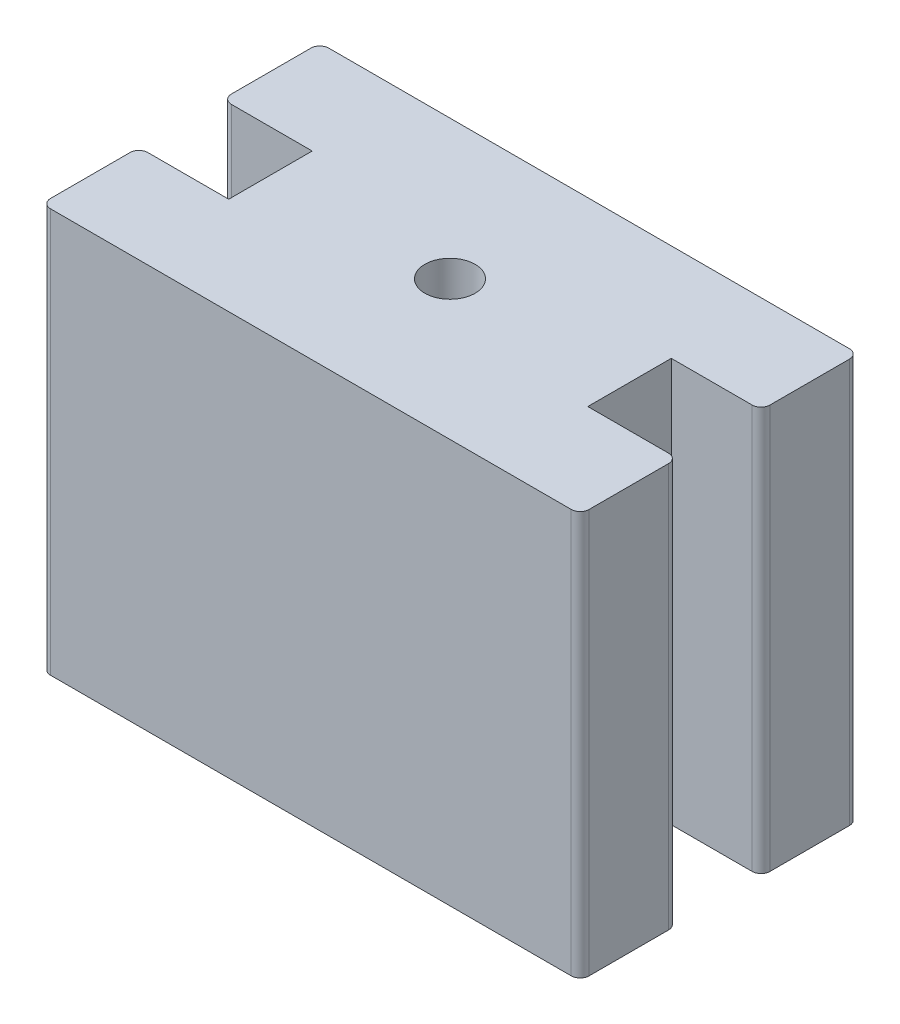
ISO-10303-21;
HEADER;
FILE_DESCRIPTION(('STEP AP214'),'2;1');
FILE_NAME('part.step','',(''),(''),'','','');
FILE_SCHEMA(('AUTOMOTIVE_DESIGN { 1 0 10303 214 1 1 1 1 }'));
ENDSEC;
DATA;
#1=APPLICATION_CONTEXT('core data for automotive mechanical design processes');
#2=APPLICATION_PROTOCOL_DEFINITION('international standard','automotive_design',2000,#1);
#3=PRODUCT_CONTEXT('',#1,'mechanical');
#4=PRODUCT('Part','Part','',(#3));
#5=PRODUCT_RELATED_PRODUCT_CATEGORY('part','',(#4));
#6=PRODUCT_DEFINITION_FORMATION('','',#4);
#7=PRODUCT_DEFINITION_CONTEXT('part definition',#1,'design');
#8=PRODUCT_DEFINITION('design','',#6,#7);
#9=PRODUCT_DEFINITION_SHAPE('','',#8);
#10=(LENGTH_UNIT() NAMED_UNIT(*) SI_UNIT(.MILLI.,.METRE.));
#11=(NAMED_UNIT(*) PLANE_ANGLE_UNIT() SI_UNIT($,.RADIAN.));
#12=(NAMED_UNIT(*) SI_UNIT($,.STERADIAN.) SOLID_ANGLE_UNIT());
#13=UNCERTAINTY_MEASURE_WITH_UNIT(LENGTH_MEASURE(1.E-05),#10,'distance_accuracy_value','');
#14=(GEOMETRIC_REPRESENTATION_CONTEXT(3) GLOBAL_UNCERTAINTY_ASSIGNED_CONTEXT((#13)) GLOBAL_UNIT_ASSIGNED_CONTEXT((#10,
#11,#12)) REPRESENTATION_CONTEXT('',''));
#15=CARTESIAN_POINT('',(0.,0.,0.));
#16=DIRECTION('',(0.,0.,1.));
#17=DIRECTION('',(1.,0.,0.));
#18=AXIS2_PLACEMENT_3D('',#15,#16,#17);
#19=CARTESIAN_POINT('',(29.,45.,-14.5));
#20=DIRECTION('',(0.,-1.,0.));
#21=DIRECTION('',(0.,0.,-1.));
#22=AXIS2_PLACEMENT_3D('',#19,#20,#21);
#23=CYLINDRICAL_SURFACE('',#22,1.);
#24=CARTESIAN_POINT('',(29.,0.,-14.5));
#25=DIRECTION('',(0.,1.,0.));
#26=DIRECTION('',(0.,0.,1.));
#27=AXIS2_PLACEMENT_3D('',#24,#25,#26);
#28=CIRCLE('',#27,1.);
#29=CARTESIAN_POINT('',(29.,0.,-15.5));
#30=VERTEX_POINT('',#29);
#31=CARTESIAN_POINT('',(30.,0.,-14.5));
#32=VERTEX_POINT('',#31);
#33=EDGE_CURVE('E298',#30,#32,#28,.F.);
#34=ORIENTED_EDGE('',*,*,#33,.F.);
#35=DIRECTION('',(0.,-1.,0.));
#36=VECTOR('',#35,1.);
#37=CARTESIAN_POINT('',(29.,45.,-15.5));
#38=LINE('',#37,#36);
#39=CARTESIAN_POINT('',(29.,45.,-15.5));
#40=VERTEX_POINT('',#39);
#41=EDGE_CURVE('E11',#40,#30,#38,.T.);
#42=ORIENTED_EDGE('',*,*,#41,.F.);
#43=CARTESIAN_POINT('',(29.,45.,-14.5));
#44=DIRECTION('',(0.,1.,0.));
#45=DIRECTION('',(0.,0.,1.));
#46=AXIS2_PLACEMENT_3D('',#43,#44,#45);
#47=CIRCLE('',#46,1.);
#48=CARTESIAN_POINT('',(30.,45.,-14.5));
#49=VERTEX_POINT('',#48);
#50=EDGE_CURVE('E465',#40,#49,#47,.F.);
#51=ORIENTED_EDGE('',*,*,#50,.T.);
#52=DIRECTION('',(0.,-1.,0.));
#53=VECTOR('',#52,1.);
#54=CARTESIAN_POINT('',(30.,45.,-14.5));
#55=LINE('',#54,#53);
#56=EDGE_CURVE('E67',#49,#32,#55,.T.);
#57=ORIENTED_EDGE('',*,*,#56,.T.);
#58=EDGE_LOOP('',(#34,#42,#51,#57));
#59=FACE_BOUND('',#58,.T.);
#60=ADVANCED_FACE('F51',(#59),#23,.T.);
#61=CARTESIAN_POINT('',(0.,45.,-15.5));
#62=DIRECTION('',(0.,0.,-1.));
#63=DIRECTION('',(-1.,0.,0.));
#64=AXIS2_PLACEMENT_3D('',#61,#62,#63);
#65=PLANE('',#64);
#66=DIRECTION('',(1.,0.,0.));
#67=VECTOR('',#66,1.);
#68=CARTESIAN_POINT('',(0.,0.,-15.5));
#69=LINE('',#68,#67);
#70=CARTESIAN_POINT('',(-29.,0.,-15.5));
#71=VERTEX_POINT('',#70);
#72=EDGE_CURVE('E291',#71,#30,#69,.T.);
#73=ORIENTED_EDGE('',*,*,#72,.F.);
#74=DIRECTION('',(0.,-1.,0.));
#75=VECTOR('',#74,1.);
#76=CARTESIAN_POINT('',(-29.,45.,-15.5));
#77=LINE('',#76,#75);
#78=CARTESIAN_POINT('',(-29.,45.,-15.5));
#79=VERTEX_POINT('',#78);
#80=EDGE_CURVE('E61',#79,#71,#77,.T.);
#81=ORIENTED_EDGE('',*,*,#80,.F.);
#82=DIRECTION('',(1.,0.,0.));
#83=VECTOR('',#82,1.);
#84=CARTESIAN_POINT('',(0.,45.,-15.5));
#85=LINE('',#84,#83);
#86=EDGE_CURVE('E470',#79,#40,#85,.T.);
#87=ORIENTED_EDGE('',*,*,#86,.T.);
#88=ORIENTED_EDGE('',*,*,#41,.T.);
#89=EDGE_LOOP('',(#73,#81,#87,#88));
#90=FACE_BOUND('',#89,.T.);
#91=ADVANCED_FACE('F300',(#90),#65,.T.);
#92=CARTESIAN_POINT('',(-29.,45.,-14.5));
#93=DIRECTION('',(0.,-1.,0.));
#94=DIRECTION('',(0.,0.,-1.));
#95=AXIS2_PLACEMENT_3D('',#92,#93,#94);
#96=CYLINDRICAL_SURFACE('',#95,1.);
#97=CARTESIAN_POINT('',(-29.,0.,-14.5));
#98=DIRECTION('',(0.,1.,0.));
#99=DIRECTION('',(0.,0.,1.));
#100=AXIS2_PLACEMENT_3D('',#97,#98,#99);
#101=CIRCLE('',#100,1.);
#102=CARTESIAN_POINT('',(-30.,0.,-14.5));
#103=VERTEX_POINT('',#102);
#104=EDGE_CURVE('E282',#71,#103,#101,.T.);
#105=ORIENTED_EDGE('',*,*,#104,.T.);
#106=DIRECTION('',(0.,-1.,0.));
#107=VECTOR('',#106,1.);
#108=CARTESIAN_POINT('',(-30.,45.,-14.5));
#109=LINE('',#108,#107);
#110=CARTESIAN_POINT('',(-30.,45.,-14.5));
#111=VERTEX_POINT('',#110);
#112=EDGE_CURVE('E271',#111,#103,#109,.T.);
#113=ORIENTED_EDGE('',*,*,#112,.F.);
#114=CARTESIAN_POINT('',(-29.,45.,-14.5));
#115=DIRECTION('',(0.,1.,0.));
#116=DIRECTION('',(0.,0.,1.));
#117=AXIS2_PLACEMENT_3D('',#114,#115,#116);
#118=CIRCLE('',#117,1.);
#119=EDGE_CURVE('E284',#79,#111,#118,.T.);
#120=ORIENTED_EDGE('',*,*,#119,.F.);
#121=ORIENTED_EDGE('',*,*,#80,.T.);
#122=EDGE_LOOP('',(#105,#113,#120,#121));
#123=FACE_BOUND('',#122,.T.);
#124=ADVANCED_FACE('F281',(#123),#96,.T.);
#125=CARTESIAN_POINT('',(-30.,45.,0.));
#126=DIRECTION('',(1.,0.,0.));
#127=DIRECTION('',(0.,0.,-1.));
#128=AXIS2_PLACEMENT_3D('',#125,#126,#127);
#129=PLANE('',#128);
#130=DIRECTION('',(0.,0.,1.));
#131=VECTOR('',#130,1.);
#132=CARTESIAN_POINT('',(-30.,0.,0.));
#133=LINE('',#132,#131);
#134=CARTESIAN_POINT('',(-30.,0.,-5.65000000000001));
#135=VERTEX_POINT('',#134);
#136=EDGE_CURVE('E293',#103,#135,#133,.T.);
#137=ORIENTED_EDGE('',*,*,#136,.T.);
#138=DIRECTION('',(0.,-1.,0.));
#139=VECTOR('',#138,1.);
#140=CARTESIAN_POINT('',(-30.,45.,-5.65000000000001));
#141=LINE('',#140,#139);
#142=CARTESIAN_POINT('',(-30.,45.,-5.65000000000001));
#143=VERTEX_POINT('',#142);
#144=EDGE_CURVE('E270',#143,#135,#141,.T.);
#145=ORIENTED_EDGE('',*,*,#144,.F.);
#146=DIRECTION('',(0.,0.,1.));
#147=VECTOR('',#146,1.);
#148=CARTESIAN_POINT('',(-30.,45.,0.));
#149=LINE('',#148,#147);
#150=EDGE_CURVE('E475',#111,#143,#149,.T.);
#151=ORIENTED_EDGE('',*,*,#150,.F.);
#152=ORIENTED_EDGE('',*,*,#112,.T.);
#153=EDGE_LOOP('',(#137,#145,#151,#152));
#154=FACE_BOUND('',#153,.T.);
#155=ADVANCED_FACE('F400',(#154),#129,.F.);
#156=CARTESIAN_POINT('',(-29.,45.,-5.65));
#157=DIRECTION('',(0.,-1.,0.));
#158=DIRECTION('',(0.,0.,-1.));
#159=AXIS2_PLACEMENT_3D('',#156,#157,#158);
#160=CYLINDRICAL_SURFACE('',#159,1.);
#161=CARTESIAN_POINT('',(-29.,0.,-5.65));
#162=DIRECTION('',(0.,1.,0.));
#163=DIRECTION('',(0.,0.,1.));
#164=AXIS2_PLACEMENT_3D('',#161,#162,#163);
#165=CIRCLE('',#164,1.);
#166=CARTESIAN_POINT('',(-29.,0.,-4.65));
#167=VERTEX_POINT('',#166);
#168=EDGE_CURVE('E309',#135,#167,#165,.T.);
#169=ORIENTED_EDGE('',*,*,#168,.T.);
#170=DIRECTION('',(0.,-1.,0.));
#171=VECTOR('',#170,1.);
#172=CARTESIAN_POINT('',(-29.,45.,-4.65));
#173=LINE('',#172,#171);
#174=CARTESIAN_POINT('',(-29.,45.,-4.65));
#175=VERTEX_POINT('',#174);
#176=EDGE_CURVE('E263',#175,#167,#173,.T.);
#177=ORIENTED_EDGE('',*,*,#176,.F.);
#178=CARTESIAN_POINT('',(-29.,45.,-5.65));
#179=DIRECTION('',(0.,1.,0.));
#180=DIRECTION('',(0.,0.,1.));
#181=AXIS2_PLACEMENT_3D('',#178,#179,#180);
#182=CIRCLE('',#181,1.);
#183=EDGE_CURVE('E480',#143,#175,#182,.T.);
#184=ORIENTED_EDGE('',*,*,#183,.F.);
#185=ORIENTED_EDGE('',*,*,#144,.T.);
#186=EDGE_LOOP('',(#169,#177,#184,#185));
#187=FACE_BOUND('',#186,.T.);
#188=ADVANCED_FACE('F399',(#187),#160,.T.);
#189=CARTESIAN_POINT('',(0.,45.,-4.65));
#190=DIRECTION('',(0.,0.,-1.));
#191=DIRECTION('',(-1.,0.,0.));
#192=AXIS2_PLACEMENT_3D('',#189,#190,#191);
#193=PLANE('',#192);
#194=DIRECTION('',(1.,0.,0.));
#195=VECTOR('',#194,1.);
#196=CARTESIAN_POINT('',(0.,0.,-4.65));
#197=LINE('',#196,#195);
#198=CARTESIAN_POINT('',(-20.,0.,-4.65));
#199=VERTEX_POINT('',#198);
#200=EDGE_CURVE('E314',#167,#199,#197,.T.);
#201=ORIENTED_EDGE('',*,*,#200,.T.);
#202=DIRECTION('',(0.,-1.,0.));
#203=VECTOR('',#202,1.);
#204=CARTESIAN_POINT('',(-20.,45.,-4.65));
#205=LINE('',#204,#203);
#206=CARTESIAN_POINT('',(-20.,45.,-4.65));
#207=VERTEX_POINT('',#206);
#208=EDGE_CURVE('E259',#207,#199,#205,.T.);
#209=ORIENTED_EDGE('',*,*,#208,.F.);
#210=DIRECTION('',(1.,0.,0.));
#211=VECTOR('',#210,1.);
#212=CARTESIAN_POINT('',(0.,45.,-4.65));
#213=LINE('',#212,#211);
#214=EDGE_CURVE('E481',#175,#207,#213,.T.);
#215=ORIENTED_EDGE('',*,*,#214,.F.);
#216=ORIENTED_EDGE('',*,*,#176,.T.);
#217=EDGE_LOOP('',(#201,#209,#215,#216));
#218=FACE_BOUND('',#217,.T.);
#219=ADVANCED_FACE('F404',(#218),#193,.F.);
#220=CARTESIAN_POINT('',(-20.,45.,0.));
#221=DIRECTION('',(1.,0.,0.));
#222=DIRECTION('',(0.,0.,-1.));
#223=AXIS2_PLACEMENT_3D('',#220,#221,#222);
#224=PLANE('',#223);
#225=DIRECTION('',(0.,0.,1.));
#226=VECTOR('',#225,1.);
#227=CARTESIAN_POINT('',(-20.,0.,0.));
#228=LINE('',#227,#226);
#229=CARTESIAN_POINT('',(-20.,0.,4.65));
#230=VERTEX_POINT('',#229);
#231=EDGE_CURVE('E318',#199,#230,#228,.T.);
#232=ORIENTED_EDGE('',*,*,#231,.T.);
#233=DIRECTION('',(0.,-1.,0.));
#234=VECTOR('',#233,1.);
#235=CARTESIAN_POINT('',(-20.,45.,4.65));
#236=LINE('',#235,#234);
#237=CARTESIAN_POINT('',(-20.,45.,4.65));
#238=VERTEX_POINT('',#237);
#239=EDGE_CURVE('E258',#238,#230,#236,.T.);
#240=ORIENTED_EDGE('',*,*,#239,.F.);
#241=DIRECTION('',(0.,0.,1.));
#242=VECTOR('',#241,1.);
#243=CARTESIAN_POINT('',(-20.,45.,0.));
#244=LINE('',#243,#242);
#245=EDGE_CURVE('E482',#207,#238,#244,.T.);
#246=ORIENTED_EDGE('',*,*,#245,.F.);
#247=ORIENTED_EDGE('',*,*,#208,.T.);
#248=EDGE_LOOP('',(#232,#240,#246,#247));
#249=FACE_BOUND('',#248,.T.);
#250=ADVANCED_FACE('F407',(#249),#224,.F.);
#251=CARTESIAN_POINT('',(0.,45.,4.64999999999999));
#252=DIRECTION('',(0.,0.,-1.));
#253=DIRECTION('',(-1.,0.,0.));
#254=AXIS2_PLACEMENT_3D('',#251,#252,#253);
#255=PLANE('',#254);
#256=DIRECTION('',(1.,0.,0.));
#257=VECTOR('',#256,1.);
#258=CARTESIAN_POINT('',(0.,0.,4.64999999999999));
#259=LINE('',#258,#257);
#260=CARTESIAN_POINT('',(-29.,0.,4.65));
#261=VERTEX_POINT('',#260);
#262=EDGE_CURVE('E325',#261,#230,#259,.T.);
#263=ORIENTED_EDGE('',*,*,#262,.F.);
#264=DIRECTION('',(0.,-1.,0.));
#265=VECTOR('',#264,1.);
#266=CARTESIAN_POINT('',(-29.,45.,4.65));
#267=LINE('',#266,#265);
#268=CARTESIAN_POINT('',(-29.,45.,4.65));
#269=VERTEX_POINT('',#268);
#270=EDGE_CURVE('E251',#269,#261,#267,.T.);
#271=ORIENTED_EDGE('',*,*,#270,.F.);
#272=DIRECTION('',(1.,0.,0.));
#273=VECTOR('',#272,1.);
#274=CARTESIAN_POINT('',(0.,45.,4.64999999999999));
#275=LINE('',#274,#273);
#276=EDGE_CURVE('E486',#269,#238,#275,.T.);
#277=ORIENTED_EDGE('',*,*,#276,.T.);
#278=ORIENTED_EDGE('',*,*,#239,.T.);
#279=EDGE_LOOP('',(#263,#271,#277,#278));
#280=FACE_BOUND('',#279,.T.);
#281=ADVANCED_FACE('F415',(#280),#255,.T.);
#282=CARTESIAN_POINT('',(-29.,45.,5.65));
#283=DIRECTION('',(0.,-1.,0.));
#284=DIRECTION('',(0.,0.,-1.));
#285=AXIS2_PLACEMENT_3D('',#282,#283,#284);
#286=CYLINDRICAL_SURFACE('',#285,1.);
#287=CARTESIAN_POINT('',(-29.,0.,5.65));
#288=DIRECTION('',(0.,1.,0.));
#289=DIRECTION('',(0.,0.,1.));
#290=AXIS2_PLACEMENT_3D('',#287,#288,#289);
#291=CIRCLE('',#290,1.);
#292=CARTESIAN_POINT('',(-30.,0.,5.65));
#293=VERTEX_POINT('',#292);
#294=EDGE_CURVE('E326',#293,#261,#291,.F.);
#295=ORIENTED_EDGE('',*,*,#294,.F.);
#296=DIRECTION('',(0.,-1.,0.));
#297=VECTOR('',#296,1.);
#298=CARTESIAN_POINT('',(-30.,45.,5.65));
#299=LINE('',#298,#297);
#300=CARTESIAN_POINT('',(-30.,45.,5.65));
#301=VERTEX_POINT('',#300);
#302=EDGE_CURVE('E249',#301,#293,#299,.T.);
#303=ORIENTED_EDGE('',*,*,#302,.F.);
#304=CARTESIAN_POINT('',(-29.,45.,5.65));
#305=DIRECTION('',(0.,1.,0.));
#306=DIRECTION('',(0.,0.,1.));
#307=AXIS2_PLACEMENT_3D('',#304,#305,#306);
#308=CIRCLE('',#307,1.);
#309=EDGE_CURVE('E489',#301,#269,#308,.F.);
#310=ORIENTED_EDGE('',*,*,#309,.T.);
#311=ORIENTED_EDGE('',*,*,#270,.T.);
#312=EDGE_LOOP('',(#295,#303,#310,#311));
#313=FACE_BOUND('',#312,.T.);
#314=ADVANCED_FACE('F418',(#313),#286,.T.);
#315=CARTESIAN_POINT('',(-30.,45.,0.));
#316=DIRECTION('',(-1.,0.,0.));
#317=DIRECTION('',(0.,0.,1.));
#318=AXIS2_PLACEMENT_3D('',#315,#316,#317);
#319=PLANE('',#318);
#320=DIRECTION('',(0.,0.,-1.));
#321=VECTOR('',#320,1.);
#322=CARTESIAN_POINT('',(-30.,0.,0.));
#323=LINE('',#322,#321);
#324=CARTESIAN_POINT('',(-30.,0.,14.5));
#325=VERTEX_POINT('',#324);
#326=EDGE_CURVE('E329',#325,#293,#323,.T.);
#327=ORIENTED_EDGE('',*,*,#326,.F.);
#328=DIRECTION('',(0.,-1.,0.));
#329=VECTOR('',#328,1.);
#330=CARTESIAN_POINT('',(-30.,45.,14.5));
#331=LINE('',#330,#329);
#332=CARTESIAN_POINT('',(-30.,45.,14.5));
#333=VERTEX_POINT('',#332);
#334=EDGE_CURVE('E250',#333,#325,#331,.T.);
#335=ORIENTED_EDGE('',*,*,#334,.F.);
#336=DIRECTION('',(0.,0.,-1.));
#337=VECTOR('',#336,1.);
#338=CARTESIAN_POINT('',(-30.,45.,0.));
#339=LINE('',#338,#337);
#340=EDGE_CURVE('E493',#333,#301,#339,.T.);
#341=ORIENTED_EDGE('',*,*,#340,.T.);
#342=ORIENTED_EDGE('',*,*,#302,.T.);
#343=EDGE_LOOP('',(#327,#335,#341,#342));
#344=FACE_BOUND('',#343,.T.);
#345=ADVANCED_FACE('F419',(#344),#319,.T.);
#346=CARTESIAN_POINT('',(-29.,45.,14.5));
#347=DIRECTION('',(0.,-1.,0.));
#348=DIRECTION('',(0.,0.,-1.));
#349=AXIS2_PLACEMENT_3D('',#346,#347,#348);
#350=CYLINDRICAL_SURFACE('',#349,1.);
#351=CARTESIAN_POINT('',(-29.,0.,14.5));
#352=DIRECTION('',(0.,1.,0.));
#353=DIRECTION('',(0.,0.,1.));
#354=AXIS2_PLACEMENT_3D('',#351,#352,#353);
#355=CIRCLE('',#354,1.);
#356=CARTESIAN_POINT('',(-29.,0.,15.5));
#357=VERTEX_POINT('',#356);
#358=EDGE_CURVE('E331',#357,#325,#355,.F.);
#359=ORIENTED_EDGE('',*,*,#358,.F.);
#360=DIRECTION('',(0.,-1.,0.));
#361=VECTOR('',#360,1.);
#362=CARTESIAN_POINT('',(-29.,45.,15.5));
#363=LINE('',#362,#361);
#364=CARTESIAN_POINT('',(-29.,45.,15.5));
#365=VERTEX_POINT('',#364);
#366=EDGE_CURVE('E243',#365,#357,#363,.T.);
#367=ORIENTED_EDGE('',*,*,#366,.F.);
#368=CARTESIAN_POINT('',(-29.,45.,14.5));
#369=DIRECTION('',(0.,1.,0.));
#370=DIRECTION('',(0.,0.,1.));
#371=AXIS2_PLACEMENT_3D('',#368,#369,#370);
#372=CIRCLE('',#371,1.);
#373=EDGE_CURVE('E499',#365,#333,#372,.F.);
#374=ORIENTED_EDGE('',*,*,#373,.T.);
#375=ORIENTED_EDGE('',*,*,#334,.T.);
#376=EDGE_LOOP('',(#359,#367,#374,#375));
#377=FACE_BOUND('',#376,.T.);
#378=ADVANCED_FACE('F424',(#377),#350,.T.);
#379=CARTESIAN_POINT('',(0.,45.,15.5));
#380=DIRECTION('',(0.,0.,-1.));
#381=DIRECTION('',(-1.,0.,0.));
#382=AXIS2_PLACEMENT_3D('',#379,#380,#381);
#383=PLANE('',#382);
#384=DIRECTION('',(1.,0.,0.));
#385=VECTOR('',#384,1.);
#386=CARTESIAN_POINT('',(0.,0.,15.5));
#387=LINE('',#386,#385);
#388=CARTESIAN_POINT('',(29.,0.,15.5));
#389=VERTEX_POINT('',#388);
#390=EDGE_CURVE('E337',#357,#389,#387,.T.);
#391=ORIENTED_EDGE('',*,*,#390,.T.);
#392=DIRECTION('',(0.,-1.,0.));
#393=VECTOR('',#392,1.);
#394=CARTESIAN_POINT('',(29.,45.,15.5));
#395=LINE('',#394,#393);
#396=CARTESIAN_POINT('',(29.,45.,15.5));
#397=VERTEX_POINT('',#396);
#398=EDGE_CURVE('E238',#397,#389,#395,.T.);
#399=ORIENTED_EDGE('',*,*,#398,.F.);
#400=DIRECTION('',(1.,0.,0.));
#401=VECTOR('',#400,1.);
#402=CARTESIAN_POINT('',(0.,45.,15.5));
#403=LINE('',#402,#401);
#404=EDGE_CURVE('E505',#365,#397,#403,.T.);
#405=ORIENTED_EDGE('',*,*,#404,.F.);
#406=ORIENTED_EDGE('',*,*,#366,.T.);
#407=EDGE_LOOP('',(#391,#399,#405,#406));
#408=FACE_BOUND('',#407,.T.);
#409=ADVANCED_FACE('F428',(#408),#383,.F.);
#410=CARTESIAN_POINT('',(29.,45.,14.5));
#411=DIRECTION('',(0.,-1.,0.));
#412=DIRECTION('',(0.,0.,-1.));
#413=AXIS2_PLACEMENT_3D('',#410,#411,#412);
#414=CYLINDRICAL_SURFACE('',#413,1.);
#415=CARTESIAN_POINT('',(29.,0.,14.5));
#416=DIRECTION('',(0.,1.,0.));
#417=DIRECTION('',(0.,0.,1.));
#418=AXIS2_PLACEMENT_3D('',#415,#416,#417);
#419=CIRCLE('',#418,1.);
#420=CARTESIAN_POINT('',(30.,0.,14.5));
#421=VERTEX_POINT('',#420);
#422=EDGE_CURVE('E345',#389,#421,#419,.T.);
#423=ORIENTED_EDGE('',*,*,#422,.T.);
#424=DIRECTION('',(0.,-1.,0.));
#425=VECTOR('',#424,1.);
#426=CARTESIAN_POINT('',(30.,45.,14.5));
#427=LINE('',#426,#425);
#428=CARTESIAN_POINT('',(30.,45.,14.5));
#429=VERTEX_POINT('',#428);
#430=EDGE_CURVE('E237',#429,#421,#427,.T.);
#431=ORIENTED_EDGE('',*,*,#430,.F.);
#432=CARTESIAN_POINT('',(29.,45.,14.5));
#433=DIRECTION('',(0.,1.,0.));
#434=DIRECTION('',(0.,0.,1.));
#435=AXIS2_PLACEMENT_3D('',#432,#433,#434);
#436=CIRCLE('',#435,1.);
#437=EDGE_CURVE('E506',#397,#429,#436,.T.);
#438=ORIENTED_EDGE('',*,*,#437,.F.);
#439=ORIENTED_EDGE('',*,*,#398,.T.);
#440=EDGE_LOOP('',(#423,#431,#438,#439));
#441=FACE_BOUND('',#440,.T.);
#442=ADVANCED_FACE('F435',(#441),#414,.T.);
#443=CARTESIAN_POINT('',(30.,45.,0.));
#444=DIRECTION('',(-1.,0.,0.));
#445=DIRECTION('',(0.,0.,1.));
#446=AXIS2_PLACEMENT_3D('',#443,#444,#445);
#447=PLANE('',#446);
#448=DIRECTION('',(0.,0.,-1.));
#449=VECTOR('',#448,1.);
#450=CARTESIAN_POINT('',(30.,0.,0.));
#451=LINE('',#450,#449);
#452=CARTESIAN_POINT('',(30.,0.,5.65));
#453=VERTEX_POINT('',#452);
#454=EDGE_CURVE('E347',#421,#453,#451,.T.);
#455=ORIENTED_EDGE('',*,*,#454,.T.);
#456=DIRECTION('',(0.,-1.,0.));
#457=VECTOR('',#456,1.);
#458=CARTESIAN_POINT('',(30.,45.,5.65));
#459=LINE('',#458,#457);
#460=CARTESIAN_POINT('',(30.,45.,5.65));
#461=VERTEX_POINT('',#460);
#462=EDGE_CURVE('E233',#461,#453,#459,.T.);
#463=ORIENTED_EDGE('',*,*,#462,.F.);
#464=DIRECTION('',(0.,0.,-1.));
#465=VECTOR('',#464,1.);
#466=CARTESIAN_POINT('',(30.,45.,0.));
#467=LINE('',#466,#465);
#468=EDGE_CURVE('E509',#429,#461,#467,.T.);
#469=ORIENTED_EDGE('',*,*,#468,.F.);
#470=ORIENTED_EDGE('',*,*,#430,.T.);
#471=EDGE_LOOP('',(#455,#463,#469,#470));
#472=FACE_BOUND('',#471,.T.);
#473=ADVANCED_FACE('F436',(#472),#447,.F.);
#474=CARTESIAN_POINT('',(29.,45.,5.64999999999999));
#475=DIRECTION('',(0.,-1.,0.));
#476=DIRECTION('',(0.,0.,-1.));
#477=AXIS2_PLACEMENT_3D('',#474,#475,#476);
#478=CYLINDRICAL_SURFACE('',#477,1.);
#479=CARTESIAN_POINT('',(29.,0.,5.64999999999999));
#480=DIRECTION('',(0.,1.,0.));
#481=DIRECTION('',(0.,0.,1.));
#482=AXIS2_PLACEMENT_3D('',#479,#480,#481);
#483=CIRCLE('',#482,1.);
#484=CARTESIAN_POINT('',(29.,0.,4.64999999999999));
#485=VERTEX_POINT('',#484);
#486=EDGE_CURVE('E349',#485,#453,#483,.F.);
#487=ORIENTED_EDGE('',*,*,#486,.F.);
#488=DIRECTION('',(0.,-1.,0.));
#489=VECTOR('',#488,1.);
#490=CARTESIAN_POINT('',(29.,45.,4.64999999999999));
#491=LINE('',#490,#489);
#492=CARTESIAN_POINT('',(29.,45.,4.64999999999999));
#493=VERTEX_POINT('',#492);
#494=EDGE_CURVE('E229',#493,#485,#491,.T.);
#495=ORIENTED_EDGE('',*,*,#494,.F.);
#496=CARTESIAN_POINT('',(29.,45.,5.64999999999999));
#497=DIRECTION('',(0.,1.,0.));
#498=DIRECTION('',(0.,0.,1.));
#499=AXIS2_PLACEMENT_3D('',#496,#497,#498);
#500=CIRCLE('',#499,1.);
#501=EDGE_CURVE('E511',#493,#461,#500,.F.);
#502=ORIENTED_EDGE('',*,*,#501,.T.);
#503=ORIENTED_EDGE('',*,*,#462,.T.);
#504=EDGE_LOOP('',(#487,#495,#502,#503));
#505=FACE_BOUND('',#504,.T.);
#506=ADVANCED_FACE('F439',(#505),#478,.T.);
#507=CARTESIAN_POINT('',(0.,45.,4.65));
#508=DIRECTION('',(0.,0.,-1.));
#509=DIRECTION('',(-1.,0.,0.));
#510=AXIS2_PLACEMENT_3D('',#507,#508,#509);
#511=PLANE('',#510);
#512=DIRECTION('',(1.,0.,0.));
#513=VECTOR('',#512,1.);
#514=CARTESIAN_POINT('',(0.,0.,4.65));
#515=LINE('',#514,#513);
#516=CARTESIAN_POINT('',(20.,0.,4.64999999999999));
#517=VERTEX_POINT('',#516);
#518=EDGE_CURVE('E352',#517,#485,#515,.T.);
#519=ORIENTED_EDGE('',*,*,#518,.F.);
#520=DIRECTION('',(0.,-1.,0.));
#521=VECTOR('',#520,1.);
#522=CARTESIAN_POINT('',(20.,45.,4.64999999999999));
#523=LINE('',#522,#521);
#524=CARTESIAN_POINT('',(20.,45.,4.64999999999999));
#525=VERTEX_POINT('',#524);
#526=EDGE_CURVE('E225',#525,#517,#523,.T.);
#527=ORIENTED_EDGE('',*,*,#526,.F.);
#528=DIRECTION('',(1.,0.,0.));
#529=VECTOR('',#528,1.);
#530=CARTESIAN_POINT('',(0.,45.,4.65));
#531=LINE('',#530,#529);
#532=EDGE_CURVE('E520',#525,#493,#531,.T.);
#533=ORIENTED_EDGE('',*,*,#532,.T.);
#534=ORIENTED_EDGE('',*,*,#494,.T.);
#535=EDGE_LOOP('',(#519,#527,#533,#534));
#536=FACE_BOUND('',#535,.T.);
#537=ADVANCED_FACE('F441',(#536),#511,.T.);
#538=CARTESIAN_POINT('',(20.,45.,0.));
#539=DIRECTION('',(1.,0.,0.));
#540=DIRECTION('',(0.,0.,-1.));
#541=AXIS2_PLACEMENT_3D('',#538,#539,#540);
#542=PLANE('',#541);
#543=DIRECTION('',(0.,0.,1.));
#544=VECTOR('',#543,1.);
#545=CARTESIAN_POINT('',(20.,0.,0.));
#546=LINE('',#545,#544);
#547=CARTESIAN_POINT('',(20.,0.,-4.65));
#548=VERTEX_POINT('',#547);
#549=EDGE_CURVE('E360',#548,#517,#546,.T.);
#550=ORIENTED_EDGE('',*,*,#549,.F.);
#551=DIRECTION('',(0.,-1.,0.));
#552=VECTOR('',#551,1.);
#553=CARTESIAN_POINT('',(20.,45.,-4.65));
#554=LINE('',#553,#552);
#555=CARTESIAN_POINT('',(20.,45.,-4.65));
#556=VERTEX_POINT('',#555);
#557=EDGE_CURVE('E216',#556,#548,#554,.T.);
#558=ORIENTED_EDGE('',*,*,#557,.F.);
#559=DIRECTION('',(0.,0.,1.));
#560=VECTOR('',#559,1.);
#561=CARTESIAN_POINT('',(20.,45.,0.));
#562=LINE('',#561,#560);
#563=EDGE_CURVE('E208',#556,#525,#562,.T.);
#564=ORIENTED_EDGE('',*,*,#563,.T.);
#565=ORIENTED_EDGE('',*,*,#526,.T.);
#566=EDGE_LOOP('',(#550,#558,#564,#565));
#567=FACE_BOUND('',#566,.T.);
#568=ADVANCED_FACE('F447',(#567),#542,.T.);
#569=CARTESIAN_POINT('',(0.,45.,-4.65));
#570=DIRECTION('',(0.,0.,-1.));
#571=DIRECTION('',(-1.,0.,0.));
#572=AXIS2_PLACEMENT_3D('',#569,#570,#571);
#573=PLANE('',#572);
#574=DIRECTION('',(1.,0.,0.));
#575=VECTOR('',#574,1.);
#576=CARTESIAN_POINT('',(0.,0.,-4.65));
#577=LINE('',#576,#575);
#578=CARTESIAN_POINT('',(29.,0.,-4.65));
#579=VERTEX_POINT('',#578);
#580=EDGE_CURVE('E212',#548,#579,#577,.T.);
#581=ORIENTED_EDGE('',*,*,#580,.T.);
#582=DIRECTION('',(0.,-1.,0.));
#583=VECTOR('',#582,1.);
#584=CARTESIAN_POINT('',(29.,45.,-4.65));
#585=LINE('',#584,#583);
#586=CARTESIAN_POINT('',(29.,45.,-4.65));
#587=VERTEX_POINT('',#586);
#588=EDGE_CURVE('E194',#587,#579,#585,.T.);
#589=ORIENTED_EDGE('',*,*,#588,.F.);
#590=DIRECTION('',(1.,0.,0.));
#591=VECTOR('',#590,1.);
#592=CARTESIAN_POINT('',(0.,45.,-4.65));
#593=LINE('',#592,#591);
#594=EDGE_CURVE('E203',#556,#587,#593,.T.);
#595=ORIENTED_EDGE('',*,*,#594,.F.);
#596=ORIENTED_EDGE('',*,*,#557,.T.);
#597=EDGE_LOOP('',(#581,#589,#595,#596));
#598=FACE_BOUND('',#597,.T.);
#599=ADVANCED_FACE('F215',(#598),#573,.F.);
#600=CARTESIAN_POINT('',(29.,45.,-5.65));
#601=DIRECTION('',(0.,-1.,0.));
#602=DIRECTION('',(0.,0.,-1.));
#603=AXIS2_PLACEMENT_3D('',#600,#601,#602);
#604=CYLINDRICAL_SURFACE('',#603,1.);
#605=CARTESIAN_POINT('',(29.,0.,-5.65));
#606=DIRECTION('',(0.,1.,0.));
#607=DIRECTION('',(0.,0.,1.));
#608=AXIS2_PLACEMENT_3D('',#605,#606,#607);
#609=CIRCLE('',#608,1.);
#610=CARTESIAN_POINT('',(30.,0.,-5.65000000000001));
#611=VERTEX_POINT('',#610);
#612=EDGE_CURVE('E361',#579,#611,#609,.T.);
#613=ORIENTED_EDGE('',*,*,#612,.T.);
#614=DIRECTION('',(0.,-1.,0.));
#615=VECTOR('',#614,1.);
#616=CARTESIAN_POINT('',(30.,45.,-5.65000000000001));
#617=LINE('',#616,#615);
#618=CARTESIAN_POINT('',(30.,45.,-5.65000000000001));
#619=VERTEX_POINT('',#618);
#620=EDGE_CURVE('E131',#619,#611,#617,.T.);
#621=ORIENTED_EDGE('',*,*,#620,.F.);
#622=CARTESIAN_POINT('',(29.,45.,-5.65));
#623=DIRECTION('',(0.,1.,0.));
#624=DIRECTION('',(0.,0.,1.));
#625=AXIS2_PLACEMENT_3D('',#622,#623,#624);
#626=CIRCLE('',#625,1.);
#627=EDGE_CURVE('E191',#587,#619,#626,.T.);
#628=ORIENTED_EDGE('',*,*,#627,.F.);
#629=ORIENTED_EDGE('',*,*,#588,.T.);
#630=EDGE_LOOP('',(#613,#621,#628,#629));
#631=FACE_BOUND('',#630,.T.);
#632=ADVANCED_FACE('F193',(#631),#604,.T.);
#633=CARTESIAN_POINT('',(0.,45.,0.));
#634=DIRECTION('',(0.,-1.,0.));
#635=DIRECTION('',(0.,0.,-1.));
#636=AXIS2_PLACEMENT_3D('',#633,#634,#635);
#637=CYLINDRICAL_SURFACE('',#636,2.8);
#638=CARTESIAN_POINT('',(0.,45.,0.));
#639=DIRECTION('',(0.,1.,0.));
#640=DIRECTION('',(0.,0.,1.));
#641=AXIS2_PLACEMENT_3D('',#638,#639,#640);
#642=CIRCLE('',#641,2.8);
#643=CARTESIAN_POINT('',(0.,45.,-2.8));
#644=VERTEX_POINT('',#643);
#645=EDGE_CURVE('E369',#644,#644,#642,.T.);
#646=CARTESIAN_POINT('',(0.,0.,0.));
#647=DIRECTION('',(0.,1.,0.));
#648=DIRECTION('',(0.,0.,1.));
#649=AXIS2_PLACEMENT_3D('',#646,#647,#648);
#650=CIRCLE('',#649,2.8);
#651=CARTESIAN_POINT('',(0.,0.,-2.8));
#652=VERTEX_POINT('',#651);
#653=EDGE_CURVE('E302',#652,#652,#650,.T.);
#654=CARTESIAN_POINT('',(0.,45.,-2.8));
#655=CARTESIAN_POINT('',(0.,44.53125,-2.8));
#656=CARTESIAN_POINT('',(0.,44.0625,-2.8));
#657=CARTESIAN_POINT('',(0.,43.125,-2.8));
#658=CARTESIAN_POINT('',(0.,42.65625,-2.8));
#659=CARTESIAN_POINT('',(0.,41.71875,-2.8));
#660=CARTESIAN_POINT('',(0.,41.25,-2.8));
#661=CARTESIAN_POINT('',(0.,40.3125,-2.8));
#662=CARTESIAN_POINT('',(0.,39.84375,-2.8));
#663=CARTESIAN_POINT('',(0.,38.90625,-2.8));
#664=CARTESIAN_POINT('',(0.,38.4375,-2.8));
#665=CARTESIAN_POINT('',(0.,37.5,-2.8));
#666=CARTESIAN_POINT('',(0.,37.03125,-2.8));
#667=CARTESIAN_POINT('',(0.,36.09375,-2.8));
#668=CARTESIAN_POINT('',(0.,35.625,-2.8));
#669=CARTESIAN_POINT('',(0.,34.6875,-2.8));
#670=CARTESIAN_POINT('',(0.,34.21875,-2.8));
#671=CARTESIAN_POINT('',(0.,33.28125,-2.8));
#672=CARTESIAN_POINT('',(0.,32.8125,-2.8));
#673=CARTESIAN_POINT('',(0.,31.875,-2.8));
#674=CARTESIAN_POINT('',(0.,31.40625,-2.8));
#675=CARTESIAN_POINT('',(0.,30.46875,-2.8));
#676=CARTESIAN_POINT('',(0.,30.,-2.8));
#677=CARTESIAN_POINT('',(0.,29.0625,-2.8));
#678=CARTESIAN_POINT('',(0.,28.59375,-2.8));
#679=CARTESIAN_POINT('',(0.,27.65625,-2.8));
#680=CARTESIAN_POINT('',(0.,27.1875,-2.8));
#681=CARTESIAN_POINT('',(0.,26.25,-2.8));
#682=CARTESIAN_POINT('',(0.,25.78125,-2.8));
#683=CARTESIAN_POINT('',(0.,24.84375,-2.8));
#684=CARTESIAN_POINT('',(0.,24.375,-2.8));
#685=CARTESIAN_POINT('',(0.,23.4375,-2.8));
#686=CARTESIAN_POINT('',(0.,22.96875,-2.8));
#687=CARTESIAN_POINT('',(0.,22.03125,-2.8));
#688=CARTESIAN_POINT('',(0.,21.5625,-2.8));
#689=CARTESIAN_POINT('',(0.,20.625,-2.8));
#690=CARTESIAN_POINT('',(0.,20.15625,-2.8));
#691=CARTESIAN_POINT('',(0.,19.21875,-2.8));
#692=CARTESIAN_POINT('',(0.,18.75,-2.8));
#693=CARTESIAN_POINT('',(0.,17.8125,-2.8));
#694=CARTESIAN_POINT('',(0.,17.34375,-2.8));
#695=CARTESIAN_POINT('',(0.,16.40625,-2.8));
#696=CARTESIAN_POINT('',(0.,15.9375,-2.8));
#697=CARTESIAN_POINT('',(0.,15.,-2.8));
#698=CARTESIAN_POINT('',(0.,14.53125,-2.8));
#699=CARTESIAN_POINT('',(0.,13.59375,-2.8));
#700=CARTESIAN_POINT('',(0.,13.125,-2.8));
#701=CARTESIAN_POINT('',(0.,12.1875,-2.8));
#702=CARTESIAN_POINT('',(0.,11.71875,-2.8));
#703=CARTESIAN_POINT('',(0.,10.78125,-2.8));
#704=CARTESIAN_POINT('',(0.,10.3125,-2.8));
#705=CARTESIAN_POINT('',(0.,9.37499999999999,-2.8));
#706=CARTESIAN_POINT('',(0.,8.90624999999999,-2.8));
#707=CARTESIAN_POINT('',(0.,7.96874999999999,-2.8));
#708=CARTESIAN_POINT('',(0.,7.5,-2.8));
#709=CARTESIAN_POINT('',(0.,6.56249999999999,-2.8));
#710=CARTESIAN_POINT('',(0.,6.09374999999999,-2.8));
#711=CARTESIAN_POINT('',(0.,5.15624999999999,-2.8));
#712=CARTESIAN_POINT('',(0.,4.68749999999999,-2.8));
#713=CARTESIAN_POINT('',(0.,3.74999999999999,-2.8));
#714=CARTESIAN_POINT('',(0.,3.28124999999999,-2.8));
#715=CARTESIAN_POINT('',(0.,2.34374999999999,-2.8));
#716=CARTESIAN_POINT('',(0.,1.87499999999999,-2.8));
#717=CARTESIAN_POINT('',(0.,0.937499999999992,-2.8));
#718=CARTESIAN_POINT('',(0.,0.468749999999993,-2.8));
#719=CARTESIAN_POINT('',(0.,0.,-2.8));
#720=B_SPLINE_CURVE_WITH_KNOTS('',3,(#654,#655,#656,#657,#658,#659,#660,#661,#662,#663,#664,
#665,#666,#667,#668,#669,#670,#671,#672,#673,#674,#675,#676,#677,#678,#679,#680,#681,#682,#683,
#684,#685,#686,#687,#688,#689,#690,#691,#692,#693,#694,#695,#696,#697,#698,#699,#700,#701,#702,
#703,#704,#705,#706,#707,#708,#709,#710,#711,#712,#713,#714,#715,#716,#717,#718,#719),
.UNSPECIFIED.,.F.,.F.,(4,2,2,2,2,2,2,2,2,2,2,2,2,2,2,2,2,2,2,2,2,2,2,2,2,2,2,2,2,2,2,2,4),(0.,
1.40625,2.8125,4.21874999999999,5.625,7.03125,8.43749999999999,9.84375,11.25,12.65625,14.0625,
15.46875,16.875,18.28125,19.6875,21.09375,22.5,23.90625,25.3125,26.71875,28.125,29.53125,
30.9375,32.34375,33.75,35.15625,36.5625,37.96875,39.375,40.78125,42.1875,43.59375,45.),.UNSPECIFIED.);
#721=EDGE_CURVE('BSEAM52',#644,#652,#720,.T.);
#722=ORIENTED_EDGE('',*,*,#645,.T.);
#723=ORIENTED_EDGE('',*,*,#653,.F.);
#724=ORIENTED_EDGE('',*,*,#721,.T.);
#725=ORIENTED_EDGE('',*,*,#721,.F.);
#726=EDGE_LOOP('',(#722,#724,#723,#725));
#727=FACE_BOUND('',#726,.T.);
#728=ADVANCED_FACE('F52',(#727),#637,.F.);
#729=CARTESIAN_POINT('',(30.,45.,0.));
#730=DIRECTION('',(1.,0.,0.));
#731=DIRECTION('',(0.,0.,-1.));
#732=AXIS2_PLACEMENT_3D('',#729,#730,#731);
#733=PLANE('',#732);
#734=DIRECTION('',(0.,0.,1.));
#735=VECTOR('',#734,1.);
#736=CARTESIAN_POINT('',(30.,0.,0.));
#737=LINE('',#736,#735);
#738=EDGE_CURVE('E368',#32,#611,#737,.T.);
#739=ORIENTED_EDGE('',*,*,#738,.F.);
#740=ORIENTED_EDGE('',*,*,#56,.F.);
#741=DIRECTION('',(0.,0.,1.));
#742=VECTOR('',#741,1.);
#743=CARTESIAN_POINT('',(30.,45.,0.));
#744=LINE('',#743,#742);
#745=EDGE_CURVE('E199',#49,#619,#744,.T.);
#746=ORIENTED_EDGE('',*,*,#745,.T.);
#747=ORIENTED_EDGE('',*,*,#620,.T.);
#748=EDGE_LOOP('',(#739,#740,#746,#747));
#749=FACE_BOUND('',#748,.T.);
#750=ADVANCED_FACE('F385',(#749),#733,.T.);
#751=CARTESIAN_POINT('',(0.,45.,0.));
#752=DIRECTION('',(0.,1.,0.));
#753=DIRECTION('',(0.,0.,1.));
#754=AXIS2_PLACEMENT_3D('',#751,#752,#753);
#755=PLANE('',#754);
#756=ORIENTED_EDGE('',*,*,#645,.F.);
#757=EDGE_LOOP('',(#756));
#758=FACE_BOUND('',#757,.T.);
#759=ORIENTED_EDGE('',*,*,#50,.F.);
#760=ORIENTED_EDGE('',*,*,#86,.F.);
#761=ORIENTED_EDGE('',*,*,#119,.T.);
#762=ORIENTED_EDGE('',*,*,#150,.T.);
#763=ORIENTED_EDGE('',*,*,#183,.T.);
#764=ORIENTED_EDGE('',*,*,#214,.T.);
#765=ORIENTED_EDGE('',*,*,#245,.T.);
#766=ORIENTED_EDGE('',*,*,#276,.F.);
#767=ORIENTED_EDGE('',*,*,#309,.F.);
#768=ORIENTED_EDGE('',*,*,#340,.F.);
#769=ORIENTED_EDGE('',*,*,#373,.F.);
#770=ORIENTED_EDGE('',*,*,#404,.T.);
#771=ORIENTED_EDGE('',*,*,#437,.T.);
#772=ORIENTED_EDGE('',*,*,#468,.T.);
#773=ORIENTED_EDGE('',*,*,#501,.F.);
#774=ORIENTED_EDGE('',*,*,#532,.F.);
#775=ORIENTED_EDGE('',*,*,#563,.F.);
#776=ORIENTED_EDGE('',*,*,#594,.T.);
#777=ORIENTED_EDGE('',*,*,#627,.T.);
#778=ORIENTED_EDGE('',*,*,#745,.F.);
#779=EDGE_LOOP('',(#759,#760,#761,#762,#763,#764,#765,#766,#767,#768,#769,#770,#771,#772,#773,
#774,#775,#776,#777,#778));
#780=FACE_BOUND('',#779,.T.);
#781=ADVANCED_FACE('F202',(#758,#780),#755,.T.);
#782=CARTESIAN_POINT('',(0.,0.,0.));
#783=DIRECTION('',(0.,1.,0.));
#784=DIRECTION('',(0.,0.,1.));
#785=AXIS2_PLACEMENT_3D('',#782,#783,#784);
#786=PLANE('',#785);
#787=ORIENTED_EDGE('',*,*,#653,.T.);
#788=EDGE_LOOP('',(#787));
#789=FACE_BOUND('',#788,.T.);
#790=ORIENTED_EDGE('',*,*,#33,.T.);
#791=ORIENTED_EDGE('',*,*,#738,.T.);
#792=ORIENTED_EDGE('',*,*,#612,.F.);
#793=ORIENTED_EDGE('',*,*,#580,.F.);
#794=ORIENTED_EDGE('',*,*,#549,.T.);
#795=ORIENTED_EDGE('',*,*,#518,.T.);
#796=ORIENTED_EDGE('',*,*,#486,.T.);
#797=ORIENTED_EDGE('',*,*,#454,.F.);
#798=ORIENTED_EDGE('',*,*,#422,.F.);
#799=ORIENTED_EDGE('',*,*,#390,.F.);
#800=ORIENTED_EDGE('',*,*,#358,.T.);
#801=ORIENTED_EDGE('',*,*,#326,.T.);
#802=ORIENTED_EDGE('',*,*,#294,.T.);
#803=ORIENTED_EDGE('',*,*,#262,.T.);
#804=ORIENTED_EDGE('',*,*,#231,.F.);
#805=ORIENTED_EDGE('',*,*,#200,.F.);
#806=ORIENTED_EDGE('',*,*,#168,.F.);
#807=ORIENTED_EDGE('',*,*,#136,.F.);
#808=ORIENTED_EDGE('',*,*,#104,.F.);
#809=ORIENTED_EDGE('',*,*,#72,.T.);
#810=EDGE_LOOP('',(#790,#791,#792,#793,#794,#795,#796,#797,#798,#799,#800,#801,#802,#803,#804,
#805,#806,#807,#808,#809));
#811=FACE_BOUND('',#810,.T.);
#812=ADVANCED_FACE('F295',(#789,#811),#786,.F.);
#813=CLOSED_SHELL('',(#60,#91,#124,#155,#188,#219,#250,#281,#314,#345,#378,#409,#442,#473,#506,
#537,#568,#599,#632,#728,#750,#781,#812));
#814=MANIFOLD_SOLID_BREP('B2',#813);
#815=ADVANCED_BREP_SHAPE_REPRESENTATION('',(#18,#814),#14);
#816=SHAPE_DEFINITION_REPRESENTATION(#9,#815);
ENDSEC;
END-ISO-10303-21;
